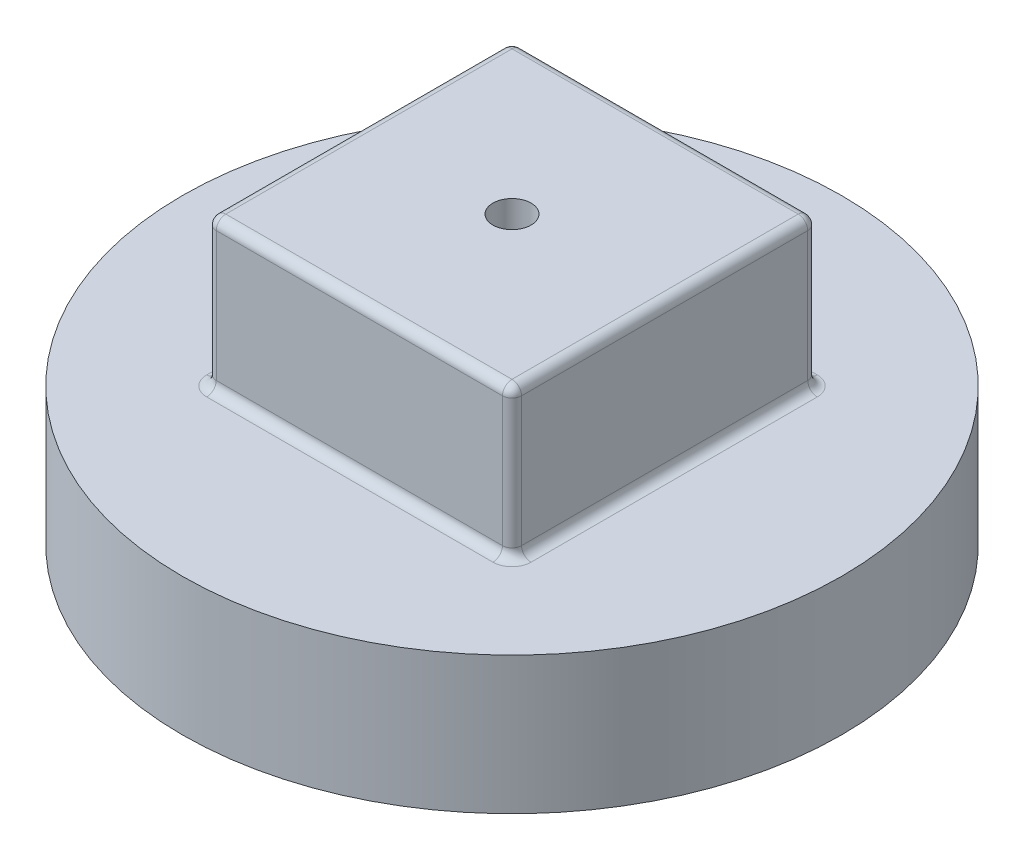
ISO-10303-21;
HEADER;
FILE_DESCRIPTION(('STEP AP214'),'2;1');
FILE_NAME('part.step','',(''),(''),'','','');
FILE_SCHEMA(('AUTOMOTIVE_DESIGN { 1 0 10303 214 1 1 1 1 }'));
ENDSEC;
DATA;
#1=APPLICATION_CONTEXT('core data for automotive mechanical design processes');
#2=APPLICATION_PROTOCOL_DEFINITION('international standard','automotive_design',2000,#1);
#3=PRODUCT_CONTEXT('',#1,'mechanical');
#4=PRODUCT('Part','Part','',(#3));
#5=PRODUCT_RELATED_PRODUCT_CATEGORY('part','',(#4));
#6=PRODUCT_DEFINITION_FORMATION('','',#4);
#7=PRODUCT_DEFINITION_CONTEXT('part definition',#1,'design');
#8=PRODUCT_DEFINITION('design','',#6,#7);
#9=PRODUCT_DEFINITION_SHAPE('','',#8);
#10=(LENGTH_UNIT() NAMED_UNIT(*) SI_UNIT(.MILLI.,.METRE.));
#11=(NAMED_UNIT(*) PLANE_ANGLE_UNIT() SI_UNIT($,.RADIAN.));
#12=(NAMED_UNIT(*) SI_UNIT($,.STERADIAN.) SOLID_ANGLE_UNIT());
#13=UNCERTAINTY_MEASURE_WITH_UNIT(LENGTH_MEASURE(1.E-05),#10,'distance_accuracy_value','');
#14=(GEOMETRIC_REPRESENTATION_CONTEXT(3) GLOBAL_UNCERTAINTY_ASSIGNED_CONTEXT((#13)) GLOBAL_UNIT_ASSIGNED_CONTEXT((#10,
#11,#12)) REPRESENTATION_CONTEXT('',''));
#15=CARTESIAN_POINT('',(0.,0.,0.));
#16=DIRECTION('',(0.,0.,1.));
#17=DIRECTION('',(1.,0.,0.));
#18=AXIS2_PLACEMENT_3D('',#15,#16,#17);
#19=CARTESIAN_POINT('',(49.784,-6.731,0.));
#20=DIRECTION('',(0.,-1.,0.));
#21=DIRECTION('',(0.,0.,-1.));
#22=AXIS2_PLACEMENT_3D('',#19,#20,#21);
#23=PLANE('',#22);
#24=CARTESIAN_POINT('',(0.,-6.73100000000004,0.));
#25=DIRECTION('',(0.,-1.,0.));
#26=DIRECTION('',(0.,0.,-1.));
#27=AXIS2_PLACEMENT_3D('',#24,#25,#26);
#28=CIRCLE('',#27,49.784);
#29=CARTESIAN_POINT('',(0.,-6.73100000000004,-49.784));
#30=VERTEX_POINT('',#29);
#31=EDGE_CURVE('E205',#30,#30,#28,.T.);
#32=ORIENTED_EDGE('',*,*,#31,.T.);
#33=EDGE_LOOP('',(#32));
#34=FACE_BOUND('',#33,.T.);
#35=CARTESIAN_POINT('',(0.,-6.73100000000004,0.));
#36=DIRECTION('',(0.,-1.,0.));
#37=DIRECTION('',(0.,0.,-1.));
#38=AXIS2_PLACEMENT_3D('',#35,#36,#37);
#39=CIRCLE('',#38,48.514);
#40=CARTESIAN_POINT('',(0.,-6.73100000000004,-48.514));
#41=VERTEX_POINT('',#40);
#42=EDGE_CURVE('E202',#41,#41,#39,.F.);
#43=ORIENTED_EDGE('',*,*,#42,.T.);
#44=EDGE_LOOP('',(#43));
#45=FACE_BOUND('',#44,.T.);
#46=ADVANCED_FACE('F34',(#34,#45),#23,.T.);
#47=CARTESIAN_POINT('',(0.,0.,0.));
#48=DIRECTION('',(0.,1.,0.));
#49=DIRECTION('',(0.,0.,1.));
#50=AXIS2_PLACEMENT_3D('',#47,#48,#49);
#51=PLANE('',#50);
#52=DIRECTION('',(1.,0.,0.));
#53=VECTOR('',#52,1.);
#54=CARTESIAN_POINT('',(0.,0.,26.9875));
#55=LINE('',#54,#53);
#56=CARTESIAN_POINT('',(23.8125,0.,26.9875));
#57=VERTEX_POINT('',#56);
#58=CARTESIAN_POINT('',(-23.8125,0.,26.9875));
#59=VERTEX_POINT('',#58);
#60=EDGE_CURVE('E241',#57,#59,#55,.F.);
#61=ORIENTED_EDGE('',*,*,#60,.T.);
#62=CARTESIAN_POINT('',(-23.8125,0.,23.8125));
#63=DIRECTION('',(0.,1.,0.));
#64=DIRECTION('',(0.,0.,1.));
#65=AXIS2_PLACEMENT_3D('',#62,#63,#64);
#66=CIRCLE('',#65,3.175);
#67=CARTESIAN_POINT('',(-26.9875,0.,23.8125));
#68=VERTEX_POINT('',#67);
#69=EDGE_CURVE('E255',#59,#68,#66,.F.);
#70=ORIENTED_EDGE('',*,*,#69,.T.);
#71=DIRECTION('',(0.,0.,1.));
#72=VECTOR('',#71,1.);
#73=CARTESIAN_POINT('',(-26.9875,0.,0.));
#74=LINE('',#73,#72);
#75=CARTESIAN_POINT('',(-26.9875,0.,-23.8125));
#76=VERTEX_POINT('',#75);
#77=EDGE_CURVE('E253',#68,#76,#74,.F.);
#78=ORIENTED_EDGE('',*,*,#77,.T.);
#79=CARTESIAN_POINT('',(-23.8125,0.,-23.8125));
#80=DIRECTION('',(0.,1.,0.));
#81=DIRECTION('',(0.,0.,1.));
#82=AXIS2_PLACEMENT_3D('',#79,#80,#81);
#83=CIRCLE('',#82,3.175);
#84=CARTESIAN_POINT('',(-23.8125,0.,-26.9875));
#85=VERTEX_POINT('',#84);
#86=EDGE_CURVE('E251',#76,#85,#83,.F.);
#87=ORIENTED_EDGE('',*,*,#86,.T.);
#88=DIRECTION('',(-1.,0.,0.));
#89=VECTOR('',#88,1.);
#90=CARTESIAN_POINT('',(0.,0.,-26.9875));
#91=LINE('',#90,#89);
#92=CARTESIAN_POINT('',(23.8125,0.,-26.9875));
#93=VERTEX_POINT('',#92);
#94=EDGE_CURVE('E249',#85,#93,#91,.F.);
#95=ORIENTED_EDGE('',*,*,#94,.T.);
#96=CARTESIAN_POINT('',(23.8125,0.,-23.8125));
#97=DIRECTION('',(0.,1.,0.));
#98=DIRECTION('',(0.,0.,1.));
#99=AXIS2_PLACEMENT_3D('',#96,#97,#98);
#100=CIRCLE('',#99,3.175);
#101=CARTESIAN_POINT('',(26.9875,0.,-23.8125));
#102=VERTEX_POINT('',#101);
#103=EDGE_CURVE('E247',#93,#102,#100,.F.);
#104=ORIENTED_EDGE('',*,*,#103,.T.);
#105=DIRECTION('',(0.,0.,-1.));
#106=VECTOR('',#105,1.);
#107=CARTESIAN_POINT('',(26.9875,0.,0.));
#108=LINE('',#107,#106);
#109=CARTESIAN_POINT('',(26.9875,0.,23.8125));
#110=VERTEX_POINT('',#109);
#111=EDGE_CURVE('E245',#102,#110,#108,.F.);
#112=ORIENTED_EDGE('',*,*,#111,.T.);
#113=CARTESIAN_POINT('',(23.8125,0.,23.8125));
#114=DIRECTION('',(0.,1.,0.));
#115=DIRECTION('',(0.,0.,1.));
#116=AXIS2_PLACEMENT_3D('',#113,#114,#115);
#117=CIRCLE('',#116,3.175);
#118=EDGE_CURVE('E243',#110,#57,#117,.F.);
#119=ORIENTED_EDGE('',*,*,#118,.T.);
#120=EDGE_LOOP('',(#61,#70,#78,#87,#95,#104,#112,#119));
#121=FACE_BOUND('',#120,.T.);
#122=CARTESIAN_POINT('',(0.,0.,0.));
#123=DIRECTION('',(0.,-1.,0.));
#124=DIRECTION('',(0.,0.,-1.));
#125=AXIS2_PLACEMENT_3D('',#122,#123,#124);
#126=CIRCLE('',#125,54.864);
#127=CARTESIAN_POINT('',(0.,0.,-54.864));
#128=VERTEX_POINT('',#127);
#129=EDGE_CURVE('E214',#128,#128,#126,.T.);
#130=ORIENTED_EDGE('',*,*,#129,.F.);
#131=EDGE_LOOP('',(#130));
#132=FACE_BOUND('',#131,.T.);
#133=ADVANCED_FACE('F365',(#121,#132),#51,.T.);
#134=CARTESIAN_POINT('',(0.,-987.311672365705,0.));
#135=DIRECTION('',(0.,-1.,0.));
#136=DIRECTION('',(0.,0.,-1.));
#137=AXIS2_PLACEMENT_3D('',#134,#135,#136);
#138=CYLINDRICAL_SURFACE('',#137,54.864);
#139=ORIENTED_EDGE('',*,*,#129,.T.);
#140=EDGE_LOOP('',(#139));
#141=FACE_BOUND('',#140,.T.);
#142=CARTESIAN_POINT('',(0.,-22.86,0.));
#143=DIRECTION('',(0.,-1.,0.));
#144=DIRECTION('',(0.,0.,-1.));
#145=AXIS2_PLACEMENT_3D('',#142,#143,#144);
#146=CIRCLE('',#145,54.864);
#147=CARTESIAN_POINT('',(0.,-22.86,-54.864));
#148=VERTEX_POINT('',#147);
#149=EDGE_CURVE('E211',#148,#148,#146,.T.);
#150=ORIENTED_EDGE('',*,*,#149,.F.);
#151=EDGE_LOOP('',(#150));
#152=FACE_BOUND('',#151,.T.);
#153=ADVANCED_FACE('F449',(#141,#152),#138,.T.);
#154=CARTESIAN_POINT('',(54.864,-22.86,0.));
#155=DIRECTION('',(0.,-1.,0.));
#156=DIRECTION('',(0.,0.,-1.));
#157=AXIS2_PLACEMENT_3D('',#154,#155,#156);
#158=PLANE('',#157);
#159=ORIENTED_EDGE('',*,*,#149,.T.);
#160=EDGE_LOOP('',(#159));
#161=FACE_BOUND('',#160,.T.);
#162=CARTESIAN_POINT('',(0.,-22.86,0.));
#163=DIRECTION('',(0.,-1.,0.));
#164=DIRECTION('',(0.,0.,-1.));
#165=AXIS2_PLACEMENT_3D('',#162,#163,#164);
#166=CIRCLE('',#165,49.784);
#167=CARTESIAN_POINT('',(0.,-22.86,-49.784));
#168=VERTEX_POINT('',#167);
#169=EDGE_CURVE('E208',#168,#168,#166,.T.);
#170=ORIENTED_EDGE('',*,*,#169,.F.);
#171=EDGE_LOOP('',(#170));
#172=FACE_BOUND('',#171,.T.);
#173=ADVANCED_FACE('F458',(#161,#172),#158,.T.);
#174=CARTESIAN_POINT('',(0.,-987.311672365705,0.));
#175=DIRECTION('',(0.,-1.,0.));
#176=DIRECTION('',(0.,0.,-1.));
#177=AXIS2_PLACEMENT_3D('',#174,#175,#176);
#178=CYLINDRICAL_SURFACE('',#177,49.784);
#179=ORIENTED_EDGE('',*,*,#169,.T.);
#180=EDGE_LOOP('',(#179));
#181=FACE_BOUND('',#180,.T.);
#182=ORIENTED_EDGE('',*,*,#31,.F.);
#183=EDGE_LOOP('',(#182));
#184=FACE_BOUND('',#183,.T.);
#185=ADVANCED_FACE('F455',(#181,#184),#178,.F.);
#186=CARTESIAN_POINT('',(-25.4,24.765,25.4));
#187=DIRECTION('',(1.,0.,0.));
#188=DIRECTION('',(0.,0.,-1.));
#189=AXIS2_PLACEMENT_3D('',#186,#187,#188);
#190=PLANE('',#189);
#191=DIRECTION('',(0.,-1.,0.));
#192=VECTOR('',#191,1.);
#193=CARTESIAN_POINT('',(-25.4,24.765,-23.8125));
#194=LINE('',#193,#192);
#195=CARTESIAN_POINT('',(-25.4,23.1775,-23.8125));
#196=VERTEX_POINT('',#195);
#197=CARTESIAN_POINT('',(-25.4,1.5875,-23.8125));
#198=VERTEX_POINT('',#197);
#199=EDGE_CURVE('E235',#196,#198,#194,.T.);
#200=ORIENTED_EDGE('',*,*,#199,.T.);
#201=DIRECTION('',(0.,0.,1.));
#202=VECTOR('',#201,1.);
#203=CARTESIAN_POINT('',(-25.4,1.5875,25.4));
#204=LINE('',#203,#202);
#205=CARTESIAN_POINT('',(-25.4,1.5875,23.8125));
#206=VERTEX_POINT('',#205);
#207=EDGE_CURVE('E266',#198,#206,#204,.T.);
#208=ORIENTED_EDGE('',*,*,#207,.T.);
#209=DIRECTION('',(0.,-1.,0.));
#210=VECTOR('',#209,1.);
#211=CARTESIAN_POINT('',(-25.4,24.765,23.8125));
#212=LINE('',#211,#210);
#213=CARTESIAN_POINT('',(-25.4,23.1775,23.8125));
#214=VERTEX_POINT('',#213);
#215=EDGE_CURVE('E238',#206,#214,#212,.F.);
#216=ORIENTED_EDGE('',*,*,#215,.T.);
#217=DIRECTION('',(0.,0.,1.));
#218=VECTOR('',#217,1.);
#219=CARTESIAN_POINT('',(-25.4,23.1775,-23.8125));
#220=LINE('',#219,#218);
#221=EDGE_CURVE('E264',#214,#196,#220,.F.);
#222=ORIENTED_EDGE('',*,*,#221,.T.);
#223=EDGE_LOOP('',(#200,#208,#216,#222));
#224=FACE_BOUND('',#223,.T.);
#225=ADVANCED_FACE('F396',(#224),#190,.F.);
#226=CARTESIAN_POINT('',(25.4,24.765,25.4));
#227=DIRECTION('',(0.,0.,-1.));
#228=DIRECTION('',(-1.,0.,0.));
#229=AXIS2_PLACEMENT_3D('',#226,#227,#228);
#230=PLANE('',#229);
#231=DIRECTION('',(0.,-1.,0.));
#232=VECTOR('',#231,1.);
#233=CARTESIAN_POINT('',(-23.8125,24.765,25.4));
#234=LINE('',#233,#232);
#235=CARTESIAN_POINT('',(-23.8125,23.1775,25.4));
#236=VERTEX_POINT('',#235);
#237=CARTESIAN_POINT('',(-23.8125,1.5875,25.4));
#238=VERTEX_POINT('',#237);
#239=EDGE_CURVE('E229',#236,#238,#234,.T.);
#240=ORIENTED_EDGE('',*,*,#239,.T.);
#241=DIRECTION('',(1.,0.,0.));
#242=VECTOR('',#241,1.);
#243=CARTESIAN_POINT('',(25.4,1.5875,25.4));
#244=LINE('',#243,#242);
#245=CARTESIAN_POINT('',(23.8125,1.5875,25.4));
#246=VERTEX_POINT('',#245);
#247=EDGE_CURVE('E11',#238,#246,#244,.T.);
#248=ORIENTED_EDGE('',*,*,#247,.T.);
#249=DIRECTION('',(0.,-1.,0.));
#250=VECTOR('',#249,1.);
#251=CARTESIAN_POINT('',(23.8125,24.765,25.4));
#252=LINE('',#251,#250);
#253=CARTESIAN_POINT('',(23.8125,23.1775,25.4));
#254=VERTEX_POINT('',#253);
#255=EDGE_CURVE('E232',#246,#254,#252,.F.);
#256=ORIENTED_EDGE('',*,*,#255,.T.);
#257=DIRECTION('',(1.,0.,0.));
#258=VECTOR('',#257,1.);
#259=CARTESIAN_POINT('',(-23.8125,23.1775,25.4));
#260=LINE('',#259,#258);
#261=EDGE_CURVE('E43',#254,#236,#260,.F.);
#262=ORIENTED_EDGE('',*,*,#261,.T.);
#263=EDGE_LOOP('',(#240,#248,#256,#262));
#264=FACE_BOUND('',#263,.T.);
#265=ADVANCED_FACE('F410',(#264),#230,.F.);
#266=CARTESIAN_POINT('',(25.4,24.765,25.4));
#267=DIRECTION('',(-1.,0.,0.));
#268=DIRECTION('',(0.,0.,1.));
#269=AXIS2_PLACEMENT_3D('',#266,#267,#268);
#270=PLANE('',#269);
#271=DIRECTION('',(0.,-1.,0.));
#272=VECTOR('',#271,1.);
#273=CARTESIAN_POINT('',(25.4,24.765,23.8125));
#274=LINE('',#273,#272);
#275=CARTESIAN_POINT('',(25.4,23.1775,23.8125));
#276=VERTEX_POINT('',#275);
#277=CARTESIAN_POINT('',(25.4,1.5875,23.8125));
#278=VERTEX_POINT('',#277);
#279=EDGE_CURVE('E223',#276,#278,#274,.T.);
#280=ORIENTED_EDGE('',*,*,#279,.T.);
#281=DIRECTION('',(0.,0.,-1.));
#282=VECTOR('',#281,1.);
#283=CARTESIAN_POINT('',(25.4,1.5875,25.4));
#284=LINE('',#283,#282);
#285=CARTESIAN_POINT('',(25.4,1.5875,-23.8125));
#286=VERTEX_POINT('',#285);
#287=EDGE_CURVE('E282',#278,#286,#284,.T.);
#288=ORIENTED_EDGE('',*,*,#287,.T.);
#289=DIRECTION('',(0.,-1.,0.));
#290=VECTOR('',#289,1.);
#291=CARTESIAN_POINT('',(25.4,24.765,-23.8125));
#292=LINE('',#291,#290);
#293=CARTESIAN_POINT('',(25.4,23.1775,-23.8125));
#294=VERTEX_POINT('',#293);
#295=EDGE_CURVE('E226',#286,#294,#292,.F.);
#296=ORIENTED_EDGE('',*,*,#295,.T.);
#297=DIRECTION('',(0.,0.,-1.));
#298=VECTOR('',#297,1.);
#299=CARTESIAN_POINT('',(25.4,23.1775,23.8125));
#300=LINE('',#299,#298);
#301=EDGE_CURVE('E280',#294,#276,#300,.F.);
#302=ORIENTED_EDGE('',*,*,#301,.T.);
#303=EDGE_LOOP('',(#280,#288,#296,#302));
#304=FACE_BOUND('',#303,.T.);
#305=ADVANCED_FACE('F350',(#304),#270,.F.);
#306=CARTESIAN_POINT('',(25.4,24.765,-25.4));
#307=DIRECTION('',(0.,0.,1.));
#308=DIRECTION('',(1.,0.,0.));
#309=AXIS2_PLACEMENT_3D('',#306,#307,#308);
#310=PLANE('',#309);
#311=DIRECTION('',(0.,-1.,0.));
#312=VECTOR('',#311,1.);
#313=CARTESIAN_POINT('',(23.8125,24.765,-25.4));
#314=LINE('',#313,#312);
#315=CARTESIAN_POINT('',(23.8125,23.1775,-25.4));
#316=VERTEX_POINT('',#315);
#317=CARTESIAN_POINT('',(23.8125,1.5875,-25.4));
#318=VERTEX_POINT('',#317);
#319=EDGE_CURVE('E220',#316,#318,#314,.T.);
#320=ORIENTED_EDGE('',*,*,#319,.T.);
#321=DIRECTION('',(-1.,0.,0.));
#322=VECTOR('',#321,1.);
#323=CARTESIAN_POINT('',(25.4,1.5875,-25.4));
#324=LINE('',#323,#322);
#325=CARTESIAN_POINT('',(-23.8125,1.5875,-25.4));
#326=VERTEX_POINT('',#325);
#327=EDGE_CURVE('E274',#318,#326,#324,.T.);
#328=ORIENTED_EDGE('',*,*,#327,.T.);
#329=DIRECTION('',(0.,-1.,0.));
#330=VECTOR('',#329,1.);
#331=CARTESIAN_POINT('',(-23.8125,24.765,-25.4));
#332=LINE('',#331,#330);
#333=CARTESIAN_POINT('',(-23.8125,23.1775,-25.4));
#334=VERTEX_POINT('',#333);
#335=EDGE_CURVE('E217',#326,#334,#332,.F.);
#336=ORIENTED_EDGE('',*,*,#335,.T.);
#337=DIRECTION('',(-1.,0.,0.));
#338=VECTOR('',#337,1.);
#339=CARTESIAN_POINT('',(23.8125,23.1775,-25.4));
#340=LINE('',#339,#338);
#341=EDGE_CURVE('E272',#334,#316,#340,.F.);
#342=ORIENTED_EDGE('',*,*,#341,.T.);
#343=EDGE_LOOP('',(#320,#328,#336,#342));
#344=FACE_BOUND('',#343,.T.);
#345=ADVANCED_FACE('F375',(#344),#310,.F.);
#346=CARTESIAN_POINT('',(0.,24.765,0.));
#347=DIRECTION('',(0.,1.,0.));
#348=DIRECTION('',(0.,0.,1.));
#349=AXIS2_PLACEMENT_3D('',#346,#347,#348);
#350=PLANE('',#349);
#351=CARTESIAN_POINT('',(0.,24.765,0.));
#352=DIRECTION('',(0.,1.,0.));
#353=DIRECTION('',(0.,0.,1.));
#354=AXIS2_PLACEMENT_3D('',#351,#352,#353);
#355=CIRCLE('',#354,3.175);
#356=CARTESIAN_POINT('',(0.,24.765,3.175));
#357=VERTEX_POINT('',#356);
#358=EDGE_CURVE('E780',#357,#357,#355,.T.);
#359=ORIENTED_EDGE('',*,*,#358,.F.);
#360=EDGE_LOOP('',(#359));
#361=FACE_BOUND('',#360,.T.);
#362=DIRECTION('',(-1.,0.,0.));
#363=VECTOR('',#362,1.);
#364=CARTESIAN_POINT('',(-23.8125,24.765,-23.8125));
#365=LINE('',#364,#363);
#366=CARTESIAN_POINT('',(23.8125,24.765,-23.8125));
#367=VERTEX_POINT('',#366);
#368=CARTESIAN_POINT('',(-23.8125,24.765,-23.8125));
#369=VERTEX_POINT('',#368);
#370=EDGE_CURVE('E51',#367,#369,#365,.T.);
#371=ORIENTED_EDGE('',*,*,#370,.T.);
#372=DIRECTION('',(0.,0.,1.));
#373=VECTOR('',#372,1.);
#374=CARTESIAN_POINT('',(-23.8125,24.765,23.8125));
#375=LINE('',#374,#373);
#376=CARTESIAN_POINT('',(-23.8125,24.765,23.8125));
#377=VERTEX_POINT('',#376);
#378=EDGE_CURVE('E292',#369,#377,#375,.T.);
#379=ORIENTED_EDGE('',*,*,#378,.T.);
#380=DIRECTION('',(1.,0.,0.));
#381=VECTOR('',#380,1.);
#382=CARTESIAN_POINT('',(23.8125,24.765,23.8125));
#383=LINE('',#382,#381);
#384=CARTESIAN_POINT('',(23.8125,24.765,23.8125));
#385=VERTEX_POINT('',#384);
#386=EDGE_CURVE('E288',#377,#385,#383,.T.);
#387=ORIENTED_EDGE('',*,*,#386,.T.);
#388=DIRECTION('',(0.,0.,-1.));
#389=VECTOR('',#388,1.);
#390=CARTESIAN_POINT('',(23.8125,24.765,-23.8125));
#391=LINE('',#390,#389);
#392=EDGE_CURVE('E56',#385,#367,#391,.T.);
#393=ORIENTED_EDGE('',*,*,#392,.T.);
#394=EDGE_LOOP('',(#371,#379,#387,#393));
#395=FACE_BOUND('',#394,.T.);
#396=ADVANCED_FACE('F433',(#361,#395),#350,.T.);
#397=CARTESIAN_POINT('',(0.,-987.311672365705,0.));
#398=DIRECTION('',(0.,-1.,0.));
#399=DIRECTION('',(0.,0.,-1.));
#400=AXIS2_PLACEMENT_3D('',#397,#398,#399);
#401=CYLINDRICAL_SURFACE('',#400,48.514);
#402=CARTESIAN_POINT('',(0.,-6.34999999999997,0.));
#403=DIRECTION('',(0.,1.,0.));
#404=DIRECTION('',(0.,0.,1.));
#405=AXIS2_PLACEMENT_3D('',#402,#403,#404);
#406=CIRCLE('',#405,48.514);
#407=CARTESIAN_POINT('',(0.,-6.34999999999997,48.514));
#408=VERTEX_POINT('',#407);
#409=EDGE_CURVE('E190',#408,#408,#406,.F.);
#410=ORIENTED_EDGE('',*,*,#409,.F.);
#411=EDGE_LOOP('',(#410));
#412=FACE_BOUND('',#411,.T.);
#413=ORIENTED_EDGE('',*,*,#42,.F.);
#414=EDGE_LOOP('',(#413));
#415=FACE_BOUND('',#414,.T.);
#416=ADVANCED_FACE('F543',(#412,#415),#401,.F.);
#417=CARTESIAN_POINT('',(0.,-6.35,0.));
#418=DIRECTION('',(0.,1.,0.));
#419=DIRECTION('',(0.,0.,1.));
#420=AXIS2_PLACEMENT_3D('',#417,#418,#419);
#421=PLANE('',#420);
#422=ORIENTED_EDGE('',*,*,#409,.T.);
#423=EDGE_LOOP('',(#422));
#424=FACE_BOUND('',#423,.T.);
#425=DIRECTION('',(1.,0.,0.));
#426=VECTOR('',#425,1.);
#427=CARTESIAN_POINT('',(25.4,-6.35,19.05));
#428=LINE('',#427,#426);
#429=CARTESIAN_POINT('',(-19.05,-6.35,19.05));
#430=VERTEX_POINT('',#429);
#431=CARTESIAN_POINT('',(19.05,-6.35,19.05));
#432=VERTEX_POINT('',#431);
#433=EDGE_CURVE('E161',#430,#432,#428,.T.);
#434=ORIENTED_EDGE('',*,*,#433,.T.);
#435=DIRECTION('',(0.,0.,-1.));
#436=VECTOR('',#435,1.);
#437=CARTESIAN_POINT('',(19.05,-6.35,25.4));
#438=LINE('',#437,#436);
#439=CARTESIAN_POINT('',(19.05,-6.35,-19.05));
#440=VERTEX_POINT('',#439);
#441=EDGE_CURVE('E165',#432,#440,#438,.T.);
#442=ORIENTED_EDGE('',*,*,#441,.T.);
#443=DIRECTION('',(-1.,0.,0.));
#444=VECTOR('',#443,1.);
#445=CARTESIAN_POINT('',(25.4,-6.35,-19.05));
#446=LINE('',#445,#444);
#447=CARTESIAN_POINT('',(-19.05,-6.35,-19.05));
#448=VERTEX_POINT('',#447);
#449=EDGE_CURVE('E183',#440,#448,#446,.T.);
#450=ORIENTED_EDGE('',*,*,#449,.T.);
#451=DIRECTION('',(0.,0.,1.));
#452=VECTOR('',#451,1.);
#453=CARTESIAN_POINT('',(-19.05,-6.35,25.4));
#454=LINE('',#453,#452);
#455=EDGE_CURVE('E168',#448,#430,#454,.T.);
#456=ORIENTED_EDGE('',*,*,#455,.T.);
#457=EDGE_LOOP('',(#434,#442,#450,#456));
#458=FACE_BOUND('',#457,.T.);
#459=ADVANCED_FACE('F163',(#424,#458),#421,.F.);
#460=CARTESIAN_POINT('',(-19.05,24.765,25.4));
#461=DIRECTION('',(1.,0.,0.));
#462=DIRECTION('',(0.,0.,-1.));
#463=AXIS2_PLACEMENT_3D('',#460,#461,#462);
#464=PLANE('',#463);
#465=ORIENTED_EDGE('',*,*,#455,.F.);
#466=DIRECTION('',(0.,-1.,0.));
#467=VECTOR('',#466,1.);
#468=CARTESIAN_POINT('',(-19.05,24.765,-19.05));
#469=LINE('',#468,#467);
#470=CARTESIAN_POINT('',(-19.05,18.415,-19.05));
#471=VERTEX_POINT('',#470);
#472=EDGE_CURVE('E193',#471,#448,#469,.T.);
#473=ORIENTED_EDGE('',*,*,#472,.F.);
#474=DIRECTION('',(0.,0.,1.));
#475=VECTOR('',#474,1.);
#476=CARTESIAN_POINT('',(-19.05,18.415,25.4));
#477=LINE('',#476,#475);
#478=CARTESIAN_POINT('',(-19.05,18.415,19.05));
#479=VERTEX_POINT('',#478);
#480=EDGE_CURVE('E185',#471,#479,#477,.T.);
#481=ORIENTED_EDGE('',*,*,#480,.T.);
#482=DIRECTION('',(0.,-1.,0.));
#483=VECTOR('',#482,1.);
#484=CARTESIAN_POINT('',(-19.05,24.765,19.05));
#485=LINE('',#484,#483);
#486=EDGE_CURVE('E178',#479,#430,#485,.T.);
#487=ORIENTED_EDGE('',*,*,#486,.T.);
#488=EDGE_LOOP('',(#465,#473,#481,#487));
#489=FACE_BOUND('',#488,.T.);
#490=ADVANCED_FACE('F566',(#489),#464,.T.);
#491=CARTESIAN_POINT('',(25.4,24.765,19.05));
#492=DIRECTION('',(0.,0.,-1.));
#493=DIRECTION('',(-1.,0.,0.));
#494=AXIS2_PLACEMENT_3D('',#491,#492,#493);
#495=PLANE('',#494);
#496=ORIENTED_EDGE('',*,*,#433,.F.);
#497=ORIENTED_EDGE('',*,*,#486,.F.);
#498=DIRECTION('',(1.,0.,0.));
#499=VECTOR('',#498,1.);
#500=CARTESIAN_POINT('',(25.4,18.415,19.05));
#501=LINE('',#500,#499);
#502=CARTESIAN_POINT('',(19.05,18.415,19.05));
#503=VERTEX_POINT('',#502);
#504=EDGE_CURVE('E175',#479,#503,#501,.T.);
#505=ORIENTED_EDGE('',*,*,#504,.T.);
#506=DIRECTION('',(0.,-1.,0.));
#507=VECTOR('',#506,1.);
#508=CARTESIAN_POINT('',(19.05,24.765,19.05));
#509=LINE('',#508,#507);
#510=EDGE_CURVE('E173',#503,#432,#509,.T.);
#511=ORIENTED_EDGE('',*,*,#510,.T.);
#512=EDGE_LOOP('',(#496,#497,#505,#511));
#513=FACE_BOUND('',#512,.T.);
#514=ADVANCED_FACE('F174',(#513),#495,.T.);
#515=CARTESIAN_POINT('',(19.05,24.765,25.4));
#516=DIRECTION('',(-1.,0.,0.));
#517=DIRECTION('',(0.,0.,1.));
#518=AXIS2_PLACEMENT_3D('',#515,#516,#517);
#519=PLANE('',#518);
#520=ORIENTED_EDGE('',*,*,#441,.F.);
#521=ORIENTED_EDGE('',*,*,#510,.F.);
#522=DIRECTION('',(0.,0.,-1.));
#523=VECTOR('',#522,1.);
#524=CARTESIAN_POINT('',(19.05,18.415,25.4));
#525=LINE('',#524,#523);
#526=CARTESIAN_POINT('',(19.05,18.415,-19.05));
#527=VERTEX_POINT('',#526);
#528=EDGE_CURVE('E198',#503,#527,#525,.T.);
#529=ORIENTED_EDGE('',*,*,#528,.T.);
#530=DIRECTION('',(0.,-1.,0.));
#531=VECTOR('',#530,1.);
#532=CARTESIAN_POINT('',(19.05,24.765,-19.05));
#533=LINE('',#532,#531);
#534=EDGE_CURVE('E179',#527,#440,#533,.T.);
#535=ORIENTED_EDGE('',*,*,#534,.T.);
#536=EDGE_LOOP('',(#520,#521,#529,#535));
#537=FACE_BOUND('',#536,.T.);
#538=ADVANCED_FACE('F181',(#537),#519,.T.);
#539=CARTESIAN_POINT('',(25.4,24.765,-19.05));
#540=DIRECTION('',(0.,0.,1.));
#541=DIRECTION('',(1.,0.,0.));
#542=AXIS2_PLACEMENT_3D('',#539,#540,#541);
#543=PLANE('',#542);
#544=ORIENTED_EDGE('',*,*,#449,.F.);
#545=ORIENTED_EDGE('',*,*,#534,.F.);
#546=DIRECTION('',(-1.,0.,0.));
#547=VECTOR('',#546,1.);
#548=CARTESIAN_POINT('',(25.4,18.415,-19.05));
#549=LINE('',#548,#547);
#550=EDGE_CURVE('E195',#527,#471,#549,.T.);
#551=ORIENTED_EDGE('',*,*,#550,.T.);
#552=ORIENTED_EDGE('',*,*,#472,.T.);
#553=EDGE_LOOP('',(#544,#545,#551,#552));
#554=FACE_BOUND('',#553,.T.);
#555=ADVANCED_FACE('F531',(#554),#543,.T.);
#556=CARTESIAN_POINT('',(0.,18.415,0.));
#557=DIRECTION('',(0.,1.,0.));
#558=DIRECTION('',(0.,0.,1.));
#559=AXIS2_PLACEMENT_3D('',#556,#557,#558);
#560=PLANE('',#559);
#561=CARTESIAN_POINT('',(0.,18.415,0.));
#562=DIRECTION('',(0.,1.,0.));
#563=DIRECTION('',(0.,0.,1.));
#564=AXIS2_PLACEMENT_3D('',#561,#562,#563);
#565=CIRCLE('',#564,3.175);
#566=CARTESIAN_POINT('',(0.,18.415,3.175));
#567=VERTEX_POINT('',#566);
#568=EDGE_CURVE('E38',#567,#567,#565,.T.);
#569=ORIENTED_EDGE('',*,*,#568,.T.);
#570=EDGE_LOOP('',(#569));
#571=FACE_BOUND('',#570,.T.);
#572=ORIENTED_EDGE('',*,*,#480,.F.);
#573=ORIENTED_EDGE('',*,*,#550,.F.);
#574=ORIENTED_EDGE('',*,*,#528,.F.);
#575=ORIENTED_EDGE('',*,*,#504,.F.);
#576=EDGE_LOOP('',(#572,#573,#574,#575));
#577=FACE_BOUND('',#576,.T.);
#578=ADVANCED_FACE('F468',(#571,#577),#560,.F.);
#579=CARTESIAN_POINT('',(23.8125,24.765,-23.8125));
#580=DIRECTION('',(0.,-1.,0.));
#581=DIRECTION('',(0.,0.,-1.));
#582=AXIS2_PLACEMENT_3D('',#579,#580,#581);
#583=CYLINDRICAL_SURFACE('',#582,1.5875);
#584=ORIENTED_EDGE('',*,*,#295,.F.);
#585=CARTESIAN_POINT('',(23.8125,1.5875,-23.8125));
#586=DIRECTION('',(0.,1.,0.));
#587=DIRECTION('',(0.,0.,1.));
#588=AXIS2_PLACEMENT_3D('',#585,#586,#587);
#589=CIRCLE('',#588,1.5875);
#590=EDGE_CURVE('E278',#286,#318,#589,.T.);
#591=ORIENTED_EDGE('',*,*,#590,.T.);
#592=ORIENTED_EDGE('',*,*,#319,.F.);
#593=CARTESIAN_POINT('',(23.8125,23.1775,-23.8125));
#594=DIRECTION('',(0.,-1.,0.));
#595=DIRECTION('',(0.,0.,-1.));
#596=AXIS2_PLACEMENT_3D('',#593,#594,#595);
#597=CIRCLE('',#596,1.5875);
#598=EDGE_CURVE('E276',#316,#294,#597,.T.);
#599=ORIENTED_EDGE('',*,*,#598,.T.);
#600=EDGE_LOOP('',(#584,#591,#592,#599));
#601=FACE_BOUND('',#600,.T.);
#602=ADVANCED_FACE('F347',(#601),#583,.T.);
#603=CARTESIAN_POINT('',(23.8125,24.765,23.8125));
#604=DIRECTION('',(0.,-1.,0.));
#605=DIRECTION('',(0.,0.,-1.));
#606=AXIS2_PLACEMENT_3D('',#603,#604,#605);
#607=CYLINDRICAL_SURFACE('',#606,1.5875);
#608=ORIENTED_EDGE('',*,*,#255,.F.);
#609=CARTESIAN_POINT('',(23.8125,1.5875,23.8125));
#610=DIRECTION('',(0.,1.,0.));
#611=DIRECTION('',(0.,0.,1.));
#612=AXIS2_PLACEMENT_3D('',#609,#610,#611);
#613=CIRCLE('',#612,1.5875);
#614=EDGE_CURVE('E286',#246,#278,#613,.T.);
#615=ORIENTED_EDGE('',*,*,#614,.T.);
#616=ORIENTED_EDGE('',*,*,#279,.F.);
#617=CARTESIAN_POINT('',(23.8125,23.1775,23.8125));
#618=DIRECTION('',(0.,-1.,0.));
#619=DIRECTION('',(0.,0.,-1.));
#620=AXIS2_PLACEMENT_3D('',#617,#618,#619);
#621=CIRCLE('',#620,1.5875);
#622=EDGE_CURVE('E284',#276,#254,#621,.T.);
#623=ORIENTED_EDGE('',*,*,#622,.T.);
#624=EDGE_LOOP('',(#608,#615,#616,#623));
#625=FACE_BOUND('',#624,.T.);
#626=ADVANCED_FACE('F413',(#625),#607,.T.);
#627=CARTESIAN_POINT('',(-23.8125,24.765,23.8125));
#628=DIRECTION('',(0.,-1.,0.));
#629=DIRECTION('',(0.,0.,-1.));
#630=AXIS2_PLACEMENT_3D('',#627,#628,#629);
#631=CYLINDRICAL_SURFACE('',#630,1.5875);
#632=ORIENTED_EDGE('',*,*,#215,.F.);
#633=CARTESIAN_POINT('',(-23.8125,1.5875,23.8125));
#634=DIRECTION('',(0.,1.,0.));
#635=DIRECTION('',(0.,0.,1.));
#636=AXIS2_PLACEMENT_3D('',#633,#634,#635);
#637=CIRCLE('',#636,1.5875);
#638=EDGE_CURVE('E261',#206,#238,#637,.T.);
#639=ORIENTED_EDGE('',*,*,#638,.T.);
#640=ORIENTED_EDGE('',*,*,#239,.F.);
#641=CARTESIAN_POINT('',(-23.8125,23.1775,23.8125));
#642=DIRECTION('',(0.,-1.,0.));
#643=DIRECTION('',(0.,0.,-1.));
#644=AXIS2_PLACEMENT_3D('',#641,#642,#643);
#645=CIRCLE('',#644,1.5875);
#646=EDGE_CURVE('E258',#236,#214,#645,.T.);
#647=ORIENTED_EDGE('',*,*,#646,.T.);
#648=EDGE_LOOP('',(#632,#639,#640,#647));
#649=FACE_BOUND('',#648,.T.);
#650=ADVANCED_FACE('F399',(#649),#631,.T.);
#651=CARTESIAN_POINT('',(-23.8125,24.765,-23.8125));
#652=DIRECTION('',(0.,-1.,0.));
#653=DIRECTION('',(0.,0.,-1.));
#654=AXIS2_PLACEMENT_3D('',#651,#652,#653);
#655=CYLINDRICAL_SURFACE('',#654,1.5875);
#656=ORIENTED_EDGE('',*,*,#335,.F.);
#657=CARTESIAN_POINT('',(-23.8125,1.5875,-23.8125));
#658=DIRECTION('',(0.,1.,0.));
#659=DIRECTION('',(0.,0.,1.));
#660=AXIS2_PLACEMENT_3D('',#657,#658,#659);
#661=CIRCLE('',#660,1.5875);
#662=EDGE_CURVE('E270',#326,#198,#661,.T.);
#663=ORIENTED_EDGE('',*,*,#662,.T.);
#664=ORIENTED_EDGE('',*,*,#199,.F.);
#665=CARTESIAN_POINT('',(-23.8125,23.1775,-23.8125));
#666=DIRECTION('',(0.,-1.,0.));
#667=DIRECTION('',(0.,0.,-1.));
#668=AXIS2_PLACEMENT_3D('',#665,#666,#667);
#669=CIRCLE('',#668,1.5875);
#670=EDGE_CURVE('E268',#196,#334,#669,.T.);
#671=ORIENTED_EDGE('',*,*,#670,.T.);
#672=EDGE_LOOP('',(#656,#663,#664,#671));
#673=FACE_BOUND('',#672,.T.);
#674=ADVANCED_FACE('F379',(#673),#655,.T.);
#675=CARTESIAN_POINT('',(23.8125,1.5875,-23.8125));
#676=DIRECTION('',(0.,1.,0.));
#677=DIRECTION('',(0.,0.,1.));
#678=AXIS2_PLACEMENT_3D('',#675,#676,#677);
#679=TOROIDAL_SURFACE('',#678,3.175,1.5875);
#680=CARTESIAN_POINT('',(23.8125,1.5875,-26.9875));
#681=DIRECTION('',(1.,0.,0.));
#682=DIRECTION('',(0.,0.,-1.));
#683=AXIS2_PLACEMENT_3D('',#680,#681,#682);
#684=CIRCLE('',#683,1.5875);
#685=EDGE_CURVE('E312',#318,#93,#684,.T.);
#686=ORIENTED_EDGE('',*,*,#685,.F.);
#687=ORIENTED_EDGE('',*,*,#590,.F.);
#688=CARTESIAN_POINT('',(26.9875,1.5875,-23.8125));
#689=DIRECTION('',(0.,0.,-1.));
#690=DIRECTION('',(-1.,0.,0.));
#691=AXIS2_PLACEMENT_3D('',#688,#689,#690);
#692=CIRCLE('',#691,1.5875);
#693=EDGE_CURVE('E315',#102,#286,#692,.T.);
#694=ORIENTED_EDGE('',*,*,#693,.F.);
#695=ORIENTED_EDGE('',*,*,#103,.F.);
#696=EDGE_LOOP('',(#686,#687,#694,#695));
#697=FACE_BOUND('',#696,.T.);
#698=ADVANCED_FACE('F372',(#697),#679,.F.);
#699=CARTESIAN_POINT('',(26.9875,1.5875,25.4));
#700=DIRECTION('',(0.,0.,-1.));
#701=DIRECTION('',(-1.,0.,0.));
#702=AXIS2_PLACEMENT_3D('',#699,#700,#701);
#703=CYLINDRICAL_SURFACE('',#702,1.5875);
#704=ORIENTED_EDGE('',*,*,#693,.T.);
#705=ORIENTED_EDGE('',*,*,#287,.F.);
#706=CARTESIAN_POINT('',(26.9875,1.5875,23.8125));
#707=DIRECTION('',(0.,0.,-1.));
#708=DIRECTION('',(-1.,0.,0.));
#709=AXIS2_PLACEMENT_3D('',#706,#707,#708);
#710=CIRCLE('',#709,1.5875);
#711=EDGE_CURVE('E309',#110,#278,#710,.T.);
#712=ORIENTED_EDGE('',*,*,#711,.F.);
#713=ORIENTED_EDGE('',*,*,#111,.F.);
#714=EDGE_LOOP('',(#704,#705,#712,#713));
#715=FACE_BOUND('',#714,.T.);
#716=ADVANCED_FACE('F355',(#715),#703,.F.);
#717=CARTESIAN_POINT('',(25.4,1.5875,-26.9875));
#718=DIRECTION('',(-1.,0.,0.));
#719=DIRECTION('',(0.,0.,1.));
#720=AXIS2_PLACEMENT_3D('',#717,#718,#719);
#721=CYLINDRICAL_SURFACE('',#720,1.5875);
#722=ORIENTED_EDGE('',*,*,#685,.T.);
#723=ORIENTED_EDGE('',*,*,#94,.F.);
#724=CARTESIAN_POINT('',(-23.8125,1.5875,-26.9875));
#725=DIRECTION('',(1.,0.,0.));
#726=DIRECTION('',(0.,1.,0.));
#727=AXIS2_PLACEMENT_3D('',#724,#725,#726);
#728=CIRCLE('',#727,1.5875);
#729=EDGE_CURVE('E306',#326,#85,#728,.T.);
#730=ORIENTED_EDGE('',*,*,#729,.F.);
#731=ORIENTED_EDGE('',*,*,#327,.F.);
#732=EDGE_LOOP('',(#722,#723,#730,#731));
#733=FACE_BOUND('',#732,.T.);
#734=ADVANCED_FACE('F384',(#733),#721,.F.);
#735=CARTESIAN_POINT('',(23.8125,1.5875,23.8125));
#736=DIRECTION('',(0.,1.,0.));
#737=DIRECTION('',(0.,0.,1.));
#738=AXIS2_PLACEMENT_3D('',#735,#736,#737);
#739=TOROIDAL_SURFACE('',#738,3.175,1.5875);
#740=ORIENTED_EDGE('',*,*,#711,.T.);
#741=ORIENTED_EDGE('',*,*,#614,.F.);
#742=CARTESIAN_POINT('',(23.8125,1.5875,26.9875));
#743=DIRECTION('',(1.,0.,0.));
#744=DIRECTION('',(0.,0.,-1.));
#745=AXIS2_PLACEMENT_3D('',#742,#743,#744);
#746=CIRCLE('',#745,1.5875);
#747=EDGE_CURVE('E303',#57,#246,#746,.T.);
#748=ORIENTED_EDGE('',*,*,#747,.F.);
#749=ORIENTED_EDGE('',*,*,#118,.F.);
#750=EDGE_LOOP('',(#740,#741,#748,#749));
#751=FACE_BOUND('',#750,.T.);
#752=ADVANCED_FACE('F361',(#751),#739,.F.);
#753=CARTESIAN_POINT('',(-23.8125,1.5875,-23.8125));
#754=DIRECTION('',(0.,1.,0.));
#755=DIRECTION('',(0.,0.,1.));
#756=AXIS2_PLACEMENT_3D('',#753,#754,#755);
#757=TOROIDAL_SURFACE('',#756,3.175,1.5875);
#758=ORIENTED_EDGE('',*,*,#729,.T.);
#759=ORIENTED_EDGE('',*,*,#86,.F.);
#760=CARTESIAN_POINT('',(-26.9875,1.5875,-23.8125));
#761=DIRECTION('',(0.,0.,-1.));
#762=DIRECTION('',(-1.,0.,0.));
#763=AXIS2_PLACEMENT_3D('',#760,#761,#762);
#764=CIRCLE('',#763,1.5875);
#765=EDGE_CURVE('E300',#198,#76,#764,.T.);
#766=ORIENTED_EDGE('',*,*,#765,.F.);
#767=ORIENTED_EDGE('',*,*,#662,.F.);
#768=EDGE_LOOP('',(#758,#759,#766,#767));
#769=FACE_BOUND('',#768,.T.);
#770=ADVANCED_FACE('F388',(#769),#757,.F.);
#771=CARTESIAN_POINT('',(25.4,1.5875,26.9875));
#772=DIRECTION('',(1.,0.,0.));
#773=DIRECTION('',(0.,0.,-1.));
#774=AXIS2_PLACEMENT_3D('',#771,#772,#773);
#775=CYLINDRICAL_SURFACE('',#774,1.5875);
#776=ORIENTED_EDGE('',*,*,#747,.T.);
#777=ORIENTED_EDGE('',*,*,#247,.F.);
#778=CARTESIAN_POINT('',(-23.8125,1.5875,26.9875));
#779=DIRECTION('',(1.,0.,0.));
#780=DIRECTION('',(0.,0.,-1.));
#781=AXIS2_PLACEMENT_3D('',#778,#779,#780);
#782=CIRCLE('',#781,1.5875);
#783=EDGE_CURVE('E297',#59,#238,#782,.T.);
#784=ORIENTED_EDGE('',*,*,#783,.F.);
#785=ORIENTED_EDGE('',*,*,#60,.F.);
#786=EDGE_LOOP('',(#776,#777,#784,#785));
#787=FACE_BOUND('',#786,.T.);
#788=ADVANCED_FACE('F407',(#787),#775,.F.);
#789=CARTESIAN_POINT('',(-26.9875,1.5875,25.4));
#790=DIRECTION('',(0.,0.,1.));
#791=DIRECTION('',(1.,0.,0.));
#792=AXIS2_PLACEMENT_3D('',#789,#790,#791);
#793=CYLINDRICAL_SURFACE('',#792,1.5875);
#794=ORIENTED_EDGE('',*,*,#765,.T.);
#795=ORIENTED_EDGE('',*,*,#77,.F.);
#796=CARTESIAN_POINT('',(-26.9875,1.5875,23.8125));
#797=DIRECTION('',(0.,0.,-1.));
#798=DIRECTION('',(-1.,0.,0.));
#799=AXIS2_PLACEMENT_3D('',#796,#797,#798);
#800=CIRCLE('',#799,1.5875);
#801=EDGE_CURVE('E295',#206,#68,#800,.T.);
#802=ORIENTED_EDGE('',*,*,#801,.F.);
#803=ORIENTED_EDGE('',*,*,#207,.F.);
#804=EDGE_LOOP('',(#794,#795,#802,#803));
#805=FACE_BOUND('',#804,.T.);
#806=ADVANCED_FACE('F393',(#805),#793,.F.);
#807=CARTESIAN_POINT('',(-23.8125,1.5875,23.8125));
#808=DIRECTION('',(0.,1.,0.));
#809=DIRECTION('',(0.,0.,1.));
#810=AXIS2_PLACEMENT_3D('',#807,#808,#809);
#811=TOROIDAL_SURFACE('',#810,3.175,1.5875);
#812=ORIENTED_EDGE('',*,*,#783,.T.);
#813=ORIENTED_EDGE('',*,*,#638,.F.);
#814=ORIENTED_EDGE('',*,*,#801,.T.);
#815=ORIENTED_EDGE('',*,*,#69,.F.);
#816=EDGE_LOOP('',(#812,#813,#814,#815));
#817=FACE_BOUND('',#816,.T.);
#818=ADVANCED_FACE('F403',(#817),#811,.F.);
#819=CARTESIAN_POINT('',(23.8125,23.1775,-23.8125));
#820=DIRECTION('',(0.,0.,1.));
#821=DIRECTION('',(1.,0.,0.));
#822=AXIS2_PLACEMENT_3D('',#819,#820,#821);
#823=SPHERICAL_SURFACE('',#822,1.5875);
#824=CARTESIAN_POINT('',(23.8125,23.1775,-23.8125));
#825=DIRECTION('',(0.,0.,1.));
#826=DIRECTION('',(1.,0.,0.));
#827=AXIS2_PLACEMENT_3D('',#824,#825,#826);
#828=CIRCLE('',#827,1.5875);
#829=EDGE_CURVE('E334',#294,#367,#828,.T.);
#830=ORIENTED_EDGE('',*,*,#829,.F.);
#831=ORIENTED_EDGE('',*,*,#598,.F.);
#832=CARTESIAN_POINT('',(23.8125,23.1775,-23.8125));
#833=DIRECTION('',(-1.,0.,0.));
#834=DIRECTION('',(0.,0.,1.));
#835=AXIS2_PLACEMENT_3D('',#832,#833,#834);
#836=CIRCLE('',#835,1.5875);
#837=EDGE_CURVE('E298',#367,#316,#836,.T.);
#838=ORIENTED_EDGE('',*,*,#837,.F.);
#839=EDGE_LOOP('',(#830,#831,#838));
#840=FACE_BOUND('',#839,.T.);
#841=ADVANCED_FACE('F36',(#840),#823,.T.);
#842=CARTESIAN_POINT('',(0.,23.1775,-23.8125));
#843=DIRECTION('',(1.,0.,0.));
#844=DIRECTION('',(0.,0.,-1.));
#845=AXIS2_PLACEMENT_3D('',#842,#843,#844);
#846=CYLINDRICAL_SURFACE('',#845,1.5875);
#847=ORIENTED_EDGE('',*,*,#837,.T.);
#848=ORIENTED_EDGE('',*,*,#341,.F.);
#849=CARTESIAN_POINT('',(-23.8125,23.1775,-23.8125));
#850=DIRECTION('',(-1.,0.,0.));
#851=DIRECTION('',(0.,0.,1.));
#852=AXIS2_PLACEMENT_3D('',#849,#850,#851);
#853=CIRCLE('',#852,1.5875);
#854=EDGE_CURVE('E331',#369,#334,#853,.T.);
#855=ORIENTED_EDGE('',*,*,#854,.F.);
#856=ORIENTED_EDGE('',*,*,#370,.F.);
#857=EDGE_LOOP('',(#847,#848,#855,#856));
#858=FACE_BOUND('',#857,.T.);
#859=ADVANCED_FACE('F339',(#858),#846,.T.);
#860=CARTESIAN_POINT('',(23.8125,23.1775,0.));
#861=DIRECTION('',(0.,0.,1.));
#862=DIRECTION('',(1.,0.,0.));
#863=AXIS2_PLACEMENT_3D('',#860,#861,#862);
#864=CYLINDRICAL_SURFACE('',#863,1.5875);
#865=ORIENTED_EDGE('',*,*,#829,.T.);
#866=ORIENTED_EDGE('',*,*,#392,.F.);
#867=CARTESIAN_POINT('',(23.8125,23.1775,23.8125));
#868=DIRECTION('',(0.,0.,1.));
#869=DIRECTION('',(1.,0.,0.));
#870=AXIS2_PLACEMENT_3D('',#867,#868,#869);
#871=CIRCLE('',#870,1.5875);
#872=EDGE_CURVE('E328',#276,#385,#871,.T.);
#873=ORIENTED_EDGE('',*,*,#872,.F.);
#874=ORIENTED_EDGE('',*,*,#301,.F.);
#875=EDGE_LOOP('',(#865,#866,#873,#874));
#876=FACE_BOUND('',#875,.T.);
#877=ADVANCED_FACE('F435',(#876),#864,.T.);
#878=CARTESIAN_POINT('',(-23.8125,23.1775,-23.8125));
#879=DIRECTION('',(0.,0.,1.));
#880=DIRECTION('',(1.,0.,0.));
#881=AXIS2_PLACEMENT_3D('',#878,#879,#880);
#882=SPHERICAL_SURFACE('',#881,1.5875);
#883=ORIENTED_EDGE('',*,*,#854,.T.);
#884=ORIENTED_EDGE('',*,*,#670,.F.);
#885=CARTESIAN_POINT('',(-23.8125,23.1775,-23.8125));
#886=DIRECTION('',(0.,0.,1.));
#887=DIRECTION('',(1.,0.,0.));
#888=AXIS2_PLACEMENT_3D('',#885,#886,#887);
#889=CIRCLE('',#888,1.5875);
#890=EDGE_CURVE('E325',#369,#196,#889,.T.);
#891=ORIENTED_EDGE('',*,*,#890,.F.);
#892=EDGE_LOOP('',(#883,#884,#891));
#893=FACE_BOUND('',#892,.T.);
#894=ADVANCED_FACE('F432',(#893),#882,.T.);
#895=CARTESIAN_POINT('',(23.8125,23.1775,23.8125));
#896=DIRECTION('',(0.,0.,1.));
#897=DIRECTION('',(1.,0.,0.));
#898=AXIS2_PLACEMENT_3D('',#895,#896,#897);
#899=SPHERICAL_SURFACE('',#898,1.5875);
#900=ORIENTED_EDGE('',*,*,#622,.F.);
#901=ORIENTED_EDGE('',*,*,#872,.T.);
#902=CARTESIAN_POINT('',(23.8125,23.1775,23.8125));
#903=DIRECTION('',(-1.,0.,0.));
#904=DIRECTION('',(0.,0.,1.));
#905=AXIS2_PLACEMENT_3D('',#902,#903,#904);
#906=CIRCLE('',#905,1.5875);
#907=EDGE_CURVE('E322',#254,#385,#906,.T.);
#908=ORIENTED_EDGE('',*,*,#907,.F.);
#909=EDGE_LOOP('',(#900,#901,#908));
#910=FACE_BOUND('',#909,.T.);
#911=ADVANCED_FACE('F417',(#910),#899,.T.);
#912=CARTESIAN_POINT('',(-23.8125,23.1775,0.));
#913=DIRECTION('',(0.,0.,-1.));
#914=DIRECTION('',(-1.,0.,0.));
#915=AXIS2_PLACEMENT_3D('',#912,#913,#914);
#916=CYLINDRICAL_SURFACE('',#915,1.5875);
#917=ORIENTED_EDGE('',*,*,#890,.T.);
#918=ORIENTED_EDGE('',*,*,#221,.F.);
#919=CARTESIAN_POINT('',(-23.8125,23.1775,23.8125));
#920=DIRECTION('',(0.,0.,1.));
#921=DIRECTION('',(1.,0.,0.));
#922=AXIS2_PLACEMENT_3D('',#919,#920,#921);
#923=CIRCLE('',#922,1.5875);
#924=EDGE_CURVE('E320',#377,#214,#923,.T.);
#925=ORIENTED_EDGE('',*,*,#924,.F.);
#926=ORIENTED_EDGE('',*,*,#378,.F.);
#927=EDGE_LOOP('',(#917,#918,#925,#926));
#928=FACE_BOUND('',#927,.T.);
#929=ADVANCED_FACE('F429',(#928),#916,.T.);
#930=CARTESIAN_POINT('',(0.,23.1775,23.8125));
#931=DIRECTION('',(-1.,0.,0.));
#932=DIRECTION('',(0.,0.,1.));
#933=AXIS2_PLACEMENT_3D('',#930,#931,#932);
#934=CYLINDRICAL_SURFACE('',#933,1.5875);
#935=ORIENTED_EDGE('',*,*,#907,.T.);
#936=ORIENTED_EDGE('',*,*,#386,.F.);
#937=CARTESIAN_POINT('',(-23.8125,23.1775,23.8125));
#938=DIRECTION('',(-1.,0.,0.));
#939=DIRECTION('',(0.,0.,1.));
#940=AXIS2_PLACEMENT_3D('',#937,#938,#939);
#941=CIRCLE('',#940,1.5875);
#942=EDGE_CURVE('E318',#236,#377,#941,.T.);
#943=ORIENTED_EDGE('',*,*,#942,.F.);
#944=ORIENTED_EDGE('',*,*,#261,.F.);
#945=EDGE_LOOP('',(#935,#936,#943,#944));
#946=FACE_BOUND('',#945,.T.);
#947=ADVANCED_FACE('F422',(#946),#934,.T.);
#948=CARTESIAN_POINT('',(-23.8125,23.1775,23.8125));
#949=DIRECTION('',(0.,0.,1.));
#950=DIRECTION('',(1.,0.,0.));
#951=AXIS2_PLACEMENT_3D('',#948,#949,#950);
#952=SPHERICAL_SURFACE('',#951,1.5875);
#953=ORIENTED_EDGE('',*,*,#924,.T.);
#954=ORIENTED_EDGE('',*,*,#646,.F.);
#955=ORIENTED_EDGE('',*,*,#942,.T.);
#956=EDGE_LOOP('',(#953,#954,#955));
#957=FACE_BOUND('',#956,.T.);
#958=ADVANCED_FACE('F424',(#957),#952,.T.);
#959=CARTESIAN_POINT('',(0.,-22.86,0.));
#960=DIRECTION('',(0.,1.,0.));
#961=DIRECTION('',(0.,0.,1.));
#962=AXIS2_PLACEMENT_3D('',#959,#960,#961);
#963=CYLINDRICAL_SURFACE('',#962,3.175);
#964=ORIENTED_EDGE('',*,*,#358,.T.);
#965=EDGE_LOOP('',(#964));
#966=FACE_BOUND('',#965,.T.);
#967=ORIENTED_EDGE('',*,*,#568,.F.);
#968=EDGE_LOOP('',(#967));
#969=FACE_BOUND('',#968,.T.);
#970=ADVANCED_FACE('F493',(#966,#969),#963,.F.);
#971=CLOSED_SHELL('',(#46,#133,#153,#173,#185,#225,#265,#305,#345,#396,#416,#459,#490,#514,#538,
#555,#578,#602,#626,#650,#674,#698,#716,#734,#752,#770,#788,#806,#818,#841,#859,#877,#894,#911,
#929,#947,#958,#970));
#972=MANIFOLD_SOLID_BREP('B2',#971);
#973=ADVANCED_BREP_SHAPE_REPRESENTATION('',(#18,#972),#14);
#974=SHAPE_DEFINITION_REPRESENTATION(#9,#973);
ENDSEC;
END-ISO-10303-21;
